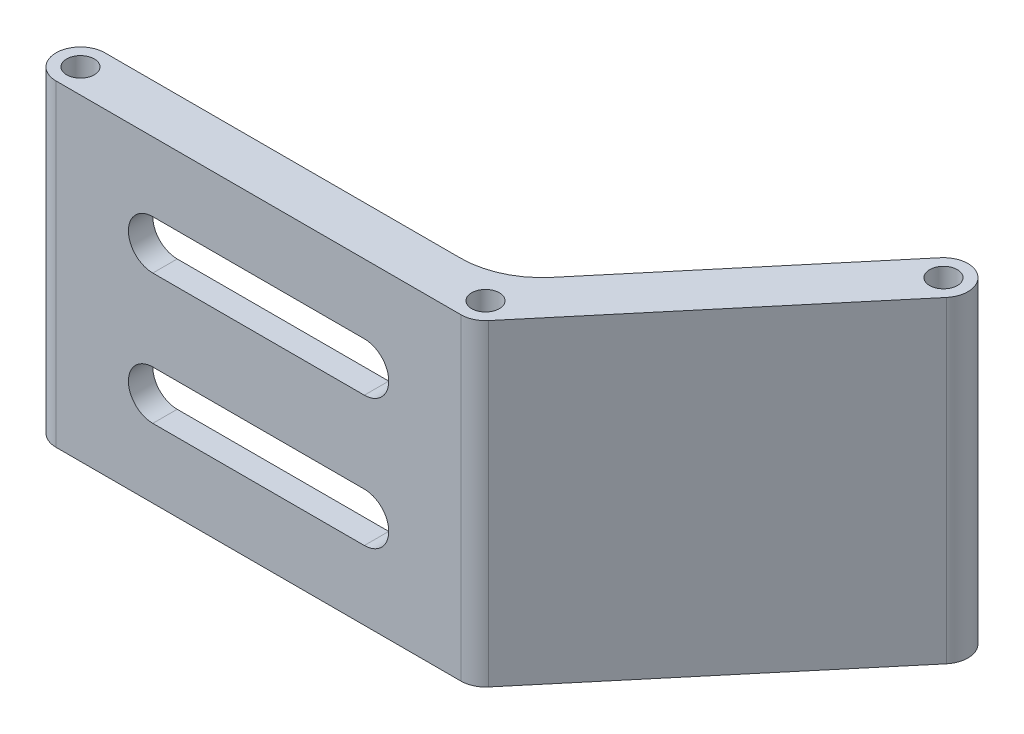
ISO-10303-21;
HEADER;
FILE_DESCRIPTION(('STEP AP214'),'2;1');
FILE_NAME('part.step','',(''),(''),'','','');
FILE_SCHEMA(('AUTOMOTIVE_DESIGN { 1 0 10303 214 1 1 1 1 }'));
ENDSEC;
DATA;
#1=APPLICATION_CONTEXT('core data for automotive mechanical design processes');
#2=APPLICATION_PROTOCOL_DEFINITION('international standard','automotive_design',2000,#1);
#3=PRODUCT_CONTEXT('',#1,'mechanical');
#4=PRODUCT('Part','Part','',(#3));
#5=PRODUCT_RELATED_PRODUCT_CATEGORY('part','',(#4));
#6=PRODUCT_DEFINITION_FORMATION('','',#4);
#7=PRODUCT_DEFINITION_CONTEXT('part definition',#1,'design');
#8=PRODUCT_DEFINITION('design','',#6,#7);
#9=PRODUCT_DEFINITION_SHAPE('','',#8);
#10=(LENGTH_UNIT() NAMED_UNIT(*) SI_UNIT(.MILLI.,.METRE.));
#11=(NAMED_UNIT(*) PLANE_ANGLE_UNIT() SI_UNIT($,.RADIAN.));
#12=(NAMED_UNIT(*) SI_UNIT($,.STERADIAN.) SOLID_ANGLE_UNIT());
#13=UNCERTAINTY_MEASURE_WITH_UNIT(LENGTH_MEASURE(1.E-05),#10,'distance_accuracy_value','');
#14=(GEOMETRIC_REPRESENTATION_CONTEXT(3) GLOBAL_UNCERTAINTY_ASSIGNED_CONTEXT((#13)) GLOBAL_UNIT_ASSIGNED_CONTEXT((#10,
#11,#12)) REPRESENTATION_CONTEXT('',''));
#15=CARTESIAN_POINT('',(0.,0.,0.));
#16=DIRECTION('',(0.,0.,1.));
#17=DIRECTION('',(1.,0.,0.));
#18=AXIS2_PLACEMENT_3D('',#15,#16,#17);
#19=CARTESIAN_POINT('',(61.1988808877318,39.,-30.620225145052));
#20=DIRECTION('',(-0.642787609686542,0.,0.766044443118975));
#21=DIRECTION('',(0.766044443118976,0.,0.642787609686542));
#22=AXIS2_PLACEMENT_3D('',#19,#20,#21);
#23=PLANE('',#22);
#24=DIRECTION('',(-0.766044443118975,0.,-0.642787609686542));
#25=VECTOR('',#24,1.);
#26=CARTESIAN_POINT('',(61.1988808877318,0.,-30.620225145052));
#27=LINE('',#26,#25);
#28=CARTESIAN_POINT('',(63.4970142170887,0.,-28.6918623159923));
#29=VERTEX_POINT('',#28);
#30=CARTESIAN_POINT('',(63.4969810572547,0.,-28.6918901403968));
#31=VERTEX_POINT('',#30);
#32=EDGE_CURVE('E448',#29,#31,#27,.T.);
#33=ORIENTED_EDGE('',*,*,#32,.T.);
#34=DIRECTION('',(0.,1.,0.));
#35=VECTOR('',#34,1.);
#36=CARTESIAN_POINT('',(63.4969810572547,36.,-28.6918901403968));
#37=LINE('',#36,#35);
#38=CARTESIAN_POINT('',(63.4969810572547,39.,-28.6918901403968));
#39=VERTEX_POINT('',#38);
#40=EDGE_CURVE('E518',#31,#39,#37,.T.);
#41=ORIENTED_EDGE('',*,*,#40,.T.);
#42=DIRECTION('',(-0.766044443118975,0.,-0.642787609686542));
#43=VECTOR('',#42,1.);
#44=CARTESIAN_POINT('',(61.1988808877318,39.,-30.620225145052));
#45=LINE('',#44,#43);
#46=CARTESIAN_POINT('',(63.4970142170887,39.,-28.6918623159923));
#47=VERTEX_POINT('',#46);
#48=EDGE_CURVE('E457',#47,#39,#45,.T.);
#49=ORIENTED_EDGE('',*,*,#48,.F.);
#50=DIRECTION('',(0.,-1.,0.));
#51=VECTOR('',#50,1.);
#52=CARTESIAN_POINT('',(63.4970142170887,39.,-28.6918623159923));
#53=LINE('',#52,#51);
#54=EDGE_CURVE('E461',#47,#29,#53,.T.);
#55=ORIENTED_EDGE('',*,*,#54,.T.);
#56=EDGE_LOOP('',(#33,#41,#49,#55));
#57=FACE_BOUND('',#56,.T.);
#58=ADVANCED_FACE('F39',(#57),#23,.F.);
#59=CARTESIAN_POINT('',(37.4338240910131,39.,-2.29813332935694));
#60=DIRECTION('',(0.766044443118979,0.,0.642787609686538));
#61=DIRECTION('',(0.642787609686538,0.,-0.766044443118979));
#62=AXIS2_PLACEMENT_3D('',#59,#60,#61);
#63=PLANE('',#62);
#64=DIRECTION('',(0.,-1.,0.));
#65=VECTOR('',#64,1.);
#66=CARTESIAN_POINT('',(59.2601589891967,39.,-28.3097463574317));
#67=LINE('',#66,#65);
#68=CARTESIAN_POINT('',(59.2601589891967,5.,-28.3097463574317));
#69=VERTEX_POINT('',#68);
#70=CARTESIAN_POINT('',(59.2601589891967,36.,-28.3097463574317));
#71=VERTEX_POINT('',#70);
#72=EDGE_CURVE('E232',#69,#71,#67,.F.);
#73=ORIENTED_EDGE('',*,*,#72,.F.);
#74=DIRECTION('',(-0.642787609686538,0.,0.766044443118979));
#75=VECTOR('',#74,1.);
#76=CARTESIAN_POINT('',(37.4338240910131,5.,-2.29813332935694));
#77=LINE('',#76,#75);
#78=CARTESIAN_POINT('',(40.8448561593638,5.,-6.3632430512679));
#79=VERTEX_POINT('',#78);
#80=EDGE_CURVE('E227',#69,#79,#77,.T.);
#81=ORIENTED_EDGE('',*,*,#80,.T.);
#82=DIRECTION('',(0.,1.,0.));
#83=VECTOR('',#82,1.);
#84=CARTESIAN_POINT('',(40.8448561593638,39.,-6.3632430512679));
#85=LINE('',#84,#83);
#86=CARTESIAN_POINT('',(40.8448561593638,36.,-6.3632430512679));
#87=VERTEX_POINT('',#86);
#88=EDGE_CURVE('E498',#79,#87,#85,.T.);
#89=ORIENTED_EDGE('',*,*,#88,.T.);
#90=DIRECTION('',(-0.642787609686538,0.,0.766044443118979));
#91=VECTOR('',#90,1.);
#92=CARTESIAN_POINT('',(37.4338240910131,36.,-2.29813332935694));
#93=LINE('',#92,#91);
#94=EDGE_CURVE('E279',#71,#87,#93,.T.);
#95=ORIENTED_EDGE('',*,*,#94,.F.);
#96=EDGE_LOOP('',(#73,#81,#89,#95));
#97=FACE_BOUND('',#96,.T.);
#98=ADVANCED_FACE('F607',(#97),#63,.F.);
#99=CARTESIAN_POINT('',(-14.2777011975798,5.,0.));
#100=DIRECTION('',(0.,1.,0.));
#101=DIRECTION('',(0.,0.,1.));
#102=AXIS2_PLACEMENT_3D('',#99,#100,#101);
#103=PLANE('',#102);
#104=ORIENTED_EDGE('',*,*,#80,.F.);
#105=CARTESIAN_POINT('',(61.1885218182563,5.,-30.6078796867887));
#106=DIRECTION('',(0.,1.,0.));
#107=DIRECTION('',(0.,0.,1.));
#108=AXIS2_PLACEMENT_3D('',#105,#106,#107);
#109=CIRCLE('',#108,3.00000000000005);
#110=CARTESIAN_POINT('',(58.8903884888994,5.,-32.5362425158483));
#111=VERTEX_POINT('',#110);
#112=EDGE_CURVE('E221',#69,#111,#109,.F.);
#113=ORIENTED_EDGE('',*,*,#112,.T.);
#114=DIRECTION('',(-0.642787609686538,0.,0.766044443118979));
#115=VECTOR('',#114,1.);
#116=CARTESIAN_POINT('',(33.2073279325966,5.,-1.92836282905961));
#117=LINE('',#116,#115);
#118=CARTESIAN_POINT('',(37.1039061371283,5.,-6.57212390313462));
#119=VERTEX_POINT('',#118);
#120=EDGE_CURVE('E225',#111,#119,#117,.T.);
#121=ORIENTED_EDGE('',*,*,#120,.T.);
#122=CARTESIAN_POINT('',(29.4434617059385,5.,-13.));
#123=DIRECTION('',(0.,1.,0.));
#124=DIRECTION('',(0.,0.,1.));
#125=AXIS2_PLACEMENT_3D('',#122,#123,#124);
#126=CIRCLE('',#125,10.);
#127=CARTESIAN_POINT('',(29.4434617059385,5.,-3.));
#128=VERTEX_POINT('',#127);
#129=EDGE_CURVE('E48',#119,#128,#126,.F.);
#130=ORIENTED_EDGE('',*,*,#129,.T.);
#131=DIRECTION('',(-1.,0.,0.));
#132=VECTOR('',#131,1.);
#133=CARTESIAN_POINT('',(-14.2777011975798,5.,-3.));
#134=LINE('',#133,#132);
#135=CARTESIAN_POINT('',(-14.2777011975798,5.,-3.));
#136=VERTEX_POINT('',#135);
#137=EDGE_CURVE('E397',#128,#136,#134,.T.);
#138=ORIENTED_EDGE('',*,*,#137,.T.);
#139=CARTESIAN_POINT('',(-14.2777011975798,5.,0.));
#140=DIRECTION('',(0.,1.,0.));
#141=DIRECTION('',(0.,0.,1.));
#142=AXIS2_PLACEMENT_3D('',#139,#140,#141);
#143=CIRCLE('',#142,3.);
#144=CARTESIAN_POINT('',(-12.3607879984449,5.,-2.30769230769231));
#145=VERTEX_POINT('',#144);
#146=EDGE_CURVE('E406',#145,#136,#143,.T.);
#147=ORIENTED_EDGE('',*,*,#146,.F.);
#148=CARTESIAN_POINT('',(-5.97107733466174,5.,-10.));
#149=DIRECTION('',(0.,1.,0.));
#150=DIRECTION('',(0.,0.,1.));
#151=AXIS2_PLACEMENT_3D('',#148,#149,#150);
#152=CIRCLE('',#151,10.);
#153=CARTESIAN_POINT('',(-5.97107733466174,5.,0.));
#154=VERTEX_POINT('',#153);
#155=EDGE_CURVE('E431',#154,#145,#152,.F.);
#156=ORIENTED_EDGE('',*,*,#155,.F.);
#157=DIRECTION('',(-1.,0.,0.));
#158=VECTOR('',#157,1.);
#159=CARTESIAN_POINT('',(-11.2777011975798,5.,0.));
#160=LINE('',#159,#158);
#161=CARTESIAN_POINT('',(27.1988373990354,5.,0.));
#162=VERTEX_POINT('',#161);
#163=EDGE_CURVE('E410',#162,#154,#160,.T.);
#164=ORIENTED_EDGE('',*,*,#163,.F.);
#165=CARTESIAN_POINT('',(27.1988373990354,5.,-10.));
#166=DIRECTION('',(0.,1.,0.));
#167=DIRECTION('',(0.,0.,1.));
#168=AXIS2_PLACEMENT_3D('',#165,#166,#167);
#169=CIRCLE('',#168,10.);
#170=CARTESIAN_POINT('',(33.5885480628186,5.,-2.30769230769231));
#171=VERTEX_POINT('',#170);
#172=EDGE_CURVE('E414',#171,#162,#169,.F.);
#173=ORIENTED_EDGE('',*,*,#172,.F.);
#174=CARTESIAN_POINT('',(35.5054612619535,5.,0.));
#175=DIRECTION('',(0.,1.,0.));
#176=DIRECTION('',(0.,0.,1.));
#177=AXIS2_PLACEMENT_3D('',#174,#175,#176);
#178=CIRCLE('',#177,3.);
#179=CARTESIAN_POINT('',(34.9698344464659,5.,-2.9517967264923));
#180=VERTEX_POINT('',#179);
#181=EDGE_CURVE('E417',#180,#171,#178,.T.);
#182=ORIENTED_EDGE('',*,*,#181,.F.);
#183=CARTESIAN_POINT('',(33.184411728174,5.,-12.7911191481333));
#184=DIRECTION('',(0.,1.,0.));
#185=DIRECTION('',(0.,0.,1.));
#186=AXIS2_PLACEMENT_3D('',#183,#184,#185);
#187=CIRCLE('',#186,10.);
#188=EDGE_CURVE('E421',#79,#180,#187,.F.);
#189=ORIENTED_EDGE('',*,*,#188,.F.);
#190=EDGE_LOOP('',(#104,#113,#121,#130,#138,#147,#156,#164,#173,#182,#189));
#191=FACE_BOUND('',#190,.T.);
#192=ADVANCED_FACE('F223',(#191),#103,.T.);
#193=CARTESIAN_POINT('',(-14.2777011975798,36.,0.));
#194=DIRECTION('',(0.,1.,0.));
#195=DIRECTION('',(0.,0.,1.));
#196=AXIS2_PLACEMENT_3D('',#193,#194,#195);
#197=PLANE('',#196);
#198=CARTESIAN_POINT('',(61.1885218182563,36.,-30.6078796867887));
#199=DIRECTION('',(0.,1.,0.));
#200=DIRECTION('',(0.,0.,1.));
#201=AXIS2_PLACEMENT_3D('',#198,#199,#200);
#202=CIRCLE('',#201,3.00000000000005);
#203=CARTESIAN_POINT('',(58.8903884888994,36.,-32.5362425158483));
#204=VERTEX_POINT('',#203);
#205=EDGE_CURVE('E582',#71,#204,#202,.F.);
#206=ORIENTED_EDGE('',*,*,#205,.F.);
#207=ORIENTED_EDGE('',*,*,#94,.T.);
#208=CARTESIAN_POINT('',(33.184411728174,36.,-12.7911191481333));
#209=DIRECTION('',(0.,1.,0.));
#210=DIRECTION('',(0.,0.,1.));
#211=AXIS2_PLACEMENT_3D('',#208,#209,#210);
#212=CIRCLE('',#211,10.);
#213=CARTESIAN_POINT('',(34.9698344464659,36.,-2.9517967264923));
#214=VERTEX_POINT('',#213);
#215=EDGE_CURVE('E393',#87,#214,#212,.F.);
#216=ORIENTED_EDGE('',*,*,#215,.T.);
#217=CARTESIAN_POINT('',(35.5054612619535,36.,0.));
#218=DIRECTION('',(0.,1.,0.));
#219=DIRECTION('',(0.,0.,1.));
#220=AXIS2_PLACEMENT_3D('',#217,#218,#219);
#221=CIRCLE('',#220,3.);
#222=CARTESIAN_POINT('',(33.5885480628186,36.,-2.30769230769231));
#223=VERTEX_POINT('',#222);
#224=EDGE_CURVE('E390',#214,#223,#221,.T.);
#225=ORIENTED_EDGE('',*,*,#224,.T.);
#226=CARTESIAN_POINT('',(27.1988373990354,36.,-10.));
#227=DIRECTION('',(0.,1.,0.));
#228=DIRECTION('',(0.,0.,1.));
#229=AXIS2_PLACEMENT_3D('',#226,#227,#228);
#230=CIRCLE('',#229,10.);
#231=CARTESIAN_POINT('',(27.1988373990354,36.,0.));
#232=VERTEX_POINT('',#231);
#233=EDGE_CURVE('E387',#223,#232,#230,.F.);
#234=ORIENTED_EDGE('',*,*,#233,.T.);
#235=DIRECTION('',(-1.,0.,0.));
#236=VECTOR('',#235,1.);
#237=CARTESIAN_POINT('',(-11.2777011975798,36.,0.));
#238=LINE('',#237,#236);
#239=CARTESIAN_POINT('',(-5.97107733466174,36.,0.));
#240=VERTEX_POINT('',#239);
#241=EDGE_CURVE('E384',#232,#240,#238,.T.);
#242=ORIENTED_EDGE('',*,*,#241,.T.);
#243=CARTESIAN_POINT('',(-5.97107733466174,36.,-10.));
#244=DIRECTION('',(0.,1.,0.));
#245=DIRECTION('',(0.,0.,1.));
#246=AXIS2_PLACEMENT_3D('',#243,#244,#245);
#247=CIRCLE('',#246,10.);
#248=CARTESIAN_POINT('',(-12.3607879984449,36.,-2.30769230769231));
#249=VERTEX_POINT('',#248);
#250=EDGE_CURVE('E430',#240,#249,#247,.F.);
#251=ORIENTED_EDGE('',*,*,#250,.T.);
#252=CARTESIAN_POINT('',(-14.2777011975798,36.,0.));
#253=DIRECTION('',(0.,1.,0.));
#254=DIRECTION('',(0.,0.,1.));
#255=AXIS2_PLACEMENT_3D('',#252,#253,#254);
#256=CIRCLE('',#255,3.);
#257=CARTESIAN_POINT('',(-14.2777011975798,36.,-3.));
#258=VERTEX_POINT('',#257);
#259=EDGE_CURVE('E380',#249,#258,#256,.T.);
#260=ORIENTED_EDGE('',*,*,#259,.T.);
#261=DIRECTION('',(-1.,0.,0.));
#262=VECTOR('',#261,1.);
#263=CARTESIAN_POINT('',(-14.2777011975798,36.,-3.));
#264=LINE('',#263,#262);
#265=CARTESIAN_POINT('',(29.4434617059385,36.,-3.));
#266=VERTEX_POINT('',#265);
#267=EDGE_CURVE('E371',#266,#258,#264,.T.);
#268=ORIENTED_EDGE('',*,*,#267,.F.);
#269=CARTESIAN_POINT('',(29.4434617059385,36.,-13.));
#270=DIRECTION('',(0.,1.,0.));
#271=DIRECTION('',(0.,0.,1.));
#272=AXIS2_PLACEMENT_3D('',#269,#270,#271);
#273=CIRCLE('',#272,10.);
#274=CARTESIAN_POINT('',(37.1039061371283,36.,-6.57212390313462));
#275=VERTEX_POINT('',#274);
#276=EDGE_CURVE('E535',#266,#275,#273,.T.);
#277=ORIENTED_EDGE('',*,*,#276,.T.);
#278=DIRECTION('',(-0.642787609686538,0.,0.766044443118979));
#279=VECTOR('',#278,1.);
#280=CARTESIAN_POINT('',(33.2073279325966,36.,-1.92836282905961));
#281=LINE('',#280,#279);
#282=EDGE_CURVE('E265',#204,#275,#281,.T.);
#283=ORIENTED_EDGE('',*,*,#282,.F.);
#284=EDGE_LOOP('',(#206,#207,#216,#225,#234,#242,#251,#260,#268,#277,#283));
#285=FACE_BOUND('',#284,.T.);
#286=ADVANCED_FACE('F543',(#285),#197,.F.);
#287=CARTESIAN_POINT('',(-14.2777011975798,5.,-3.));
#288=DIRECTION('',(0.,0.,1.));
#289=DIRECTION('',(1.,0.,0.));
#290=AXIS2_PLACEMENT_3D('',#287,#288,#289);
#291=PLANE('',#290);
#292=ORIENTED_EDGE('',*,*,#137,.F.);
#293=DIRECTION('',(0.,1.,0.));
#294=VECTOR('',#293,1.);
#295=CARTESIAN_POINT('',(29.4434617059385,0.,-3.));
#296=LINE('',#295,#294);
#297=CARTESIAN_POINT('',(29.4434617059385,0.,-3.));
#298=VERTEX_POINT('',#297);
#299=EDGE_CURVE('E61',#128,#298,#296,.F.);
#300=ORIENTED_EDGE('',*,*,#299,.T.);
#301=DIRECTION('',(-1.,0.,0.));
#302=VECTOR('',#301,1.);
#303=CARTESIAN_POINT('',(-14.2777011975798,0.,-3.));
#304=LINE('',#303,#302);
#305=CARTESIAN_POINT('',(-14.2777011975798,0.,-3.));
#306=VERTEX_POINT('',#305);
#307=EDGE_CURVE('E396',#298,#306,#304,.T.);
#308=ORIENTED_EDGE('',*,*,#307,.T.);
#309=DIRECTION('',(0.,-1.,0.));
#310=VECTOR('',#309,1.);
#311=CARTESIAN_POINT('',(-14.2777011975798,5.,-3.));
#312=LINE('',#311,#310);
#313=EDGE_CURVE('E400',#136,#306,#312,.T.);
#314=ORIENTED_EDGE('',*,*,#313,.F.);
#315=EDGE_LOOP('',(#292,#300,#308,#314));
#316=FACE_BOUND('',#315,.T.);
#317=ADVANCED_FACE('F638',(#316),#291,.F.);
#318=CARTESIAN_POINT('',(33.184411728174,39.,-12.7911191481333));
#319=DIRECTION('',(0.,-1.,0.));
#320=DIRECTION('',(0.,0.,-1.));
#321=AXIS2_PLACEMENT_3D('',#318,#319,#320);
#322=CYLINDRICAL_SURFACE('',#321,10.);
#323=ORIENTED_EDGE('',*,*,#88,.F.);
#324=ORIENTED_EDGE('',*,*,#188,.T.);
#325=DIRECTION('',(0.,-1.,0.));
#326=VECTOR('',#325,1.);
#327=CARTESIAN_POINT('',(34.9698344464659,39.,-2.9517967264923));
#328=LINE('',#327,#326);
#329=EDGE_CURVE('E495',#214,#180,#328,.T.);
#330=ORIENTED_EDGE('',*,*,#329,.F.);
#331=ORIENTED_EDGE('',*,*,#215,.F.);
#332=EDGE_LOOP('',(#323,#324,#330,#331));
#333=FACE_BOUND('',#332,.T.);
#334=ADVANCED_FACE('F634',(#333),#322,.F.);
#335=CARTESIAN_POINT('',(35.5054612619535,39.,0.));
#336=DIRECTION('',(0.,-1.,0.));
#337=DIRECTION('',(0.,0.,-1.));
#338=AXIS2_PLACEMENT_3D('',#335,#336,#337);
#339=CYLINDRICAL_SURFACE('',#338,3.);
#340=ORIENTED_EDGE('',*,*,#224,.F.);
#341=ORIENTED_EDGE('',*,*,#329,.T.);
#342=ORIENTED_EDGE('',*,*,#181,.T.);
#343=DIRECTION('',(0.,-1.,0.));
#344=VECTOR('',#343,1.);
#345=CARTESIAN_POINT('',(33.5885480628186,39.,-2.30769230769231));
#346=LINE('',#345,#344);
#347=EDGE_CURVE('E491',#171,#223,#346,.F.);
#348=ORIENTED_EDGE('',*,*,#347,.T.);
#349=EDGE_LOOP('',(#340,#341,#342,#348));
#350=FACE_BOUND('',#349,.T.);
#351=ADVANCED_FACE('F630',(#350),#339,.T.);
#352=CARTESIAN_POINT('',(-11.2777011975798,39.,0.));
#353=DIRECTION('',(0.,0.,1.));
#354=DIRECTION('',(1.,0.,0.));
#355=AXIS2_PLACEMENT_3D('',#352,#353,#354);
#356=PLANE('',#355);
#357=DIRECTION('',(-1.,0.,0.));
#358=VECTOR('',#357,1.);
#359=CARTESIAN_POINT('',(-11.2777011975798,30.5,0.));
#360=LINE('',#359,#358);
#361=CARTESIAN_POINT('',(23.6138800321868,30.5,0.));
#362=VERTEX_POINT('',#361);
#363=CARTESIAN_POINT('',(-2.38611996781316,30.5,0.));
#364=VERTEX_POINT('',#363);
#365=EDGE_CURVE('E362',#362,#364,#360,.T.);
#366=ORIENTED_EDGE('',*,*,#365,.T.);
#367=CARTESIAN_POINT('',(-2.38611996781316,27.5,0.));
#368=DIRECTION('',(0.,0.,1.));
#369=DIRECTION('',(1.,0.,0.));
#370=AXIS2_PLACEMENT_3D('',#367,#368,#369);
#371=CIRCLE('',#370,3.);
#372=CARTESIAN_POINT('',(-2.38611996781315,24.5,0.));
#373=VERTEX_POINT('',#372);
#374=EDGE_CURVE('E366',#364,#373,#371,.T.);
#375=ORIENTED_EDGE('',*,*,#374,.T.);
#376=DIRECTION('',(1.,0.,0.));
#377=VECTOR('',#376,1.);
#378=CARTESIAN_POINT('',(-11.2777011975798,24.5,0.));
#379=LINE('',#378,#377);
#380=CARTESIAN_POINT('',(23.6138800321868,24.5,0.));
#381=VERTEX_POINT('',#380);
#382=EDGE_CURVE('E354',#373,#381,#379,.T.);
#383=ORIENTED_EDGE('',*,*,#382,.T.);
#384=CARTESIAN_POINT('',(23.6138800321868,27.5,0.));
#385=DIRECTION('',(0.,0.,1.));
#386=DIRECTION('',(1.,0.,0.));
#387=AXIS2_PLACEMENT_3D('',#384,#385,#386);
#388=CIRCLE('',#387,3.);
#389=EDGE_CURVE('E358',#381,#362,#388,.T.);
#390=ORIENTED_EDGE('',*,*,#389,.T.);
#391=EDGE_LOOP('',(#366,#375,#383,#390));
#392=FACE_BOUND('',#391,.T.);
#393=DIRECTION('',(-1.,0.,0.));
#394=VECTOR('',#393,1.);
#395=CARTESIAN_POINT('',(-11.2777011975798,14.5,0.));
#396=LINE('',#395,#394);
#397=CARTESIAN_POINT('',(23.6138800321868,14.5,0.));
#398=VERTEX_POINT('',#397);
#399=CARTESIAN_POINT('',(-2.38611996781315,14.5,0.));
#400=VERTEX_POINT('',#399);
#401=EDGE_CURVE('E346',#398,#400,#396,.T.);
#402=ORIENTED_EDGE('',*,*,#401,.T.);
#403=CARTESIAN_POINT('',(-2.38611996781316,11.5,0.));
#404=DIRECTION('',(0.,0.,1.));
#405=DIRECTION('',(1.,0.,0.));
#406=AXIS2_PLACEMENT_3D('',#403,#404,#405);
#407=CIRCLE('',#406,3.);
#408=CARTESIAN_POINT('',(-2.38611996781315,8.5,0.));
#409=VERTEX_POINT('',#408);
#410=EDGE_CURVE('E350',#400,#409,#407,.T.);
#411=ORIENTED_EDGE('',*,*,#410,.T.);
#412=DIRECTION('',(1.,0.,0.));
#413=VECTOR('',#412,1.);
#414=CARTESIAN_POINT('',(-11.2777011975798,8.5,0.));
#415=LINE('',#414,#413);
#416=CARTESIAN_POINT('',(23.6138800321868,8.5,0.));
#417=VERTEX_POINT('',#416);
#418=EDGE_CURVE('E303',#409,#417,#415,.T.);
#419=ORIENTED_EDGE('',*,*,#418,.T.);
#420=CARTESIAN_POINT('',(23.6138800321868,11.5,0.));
#421=DIRECTION('',(0.,0.,1.));
#422=DIRECTION('',(1.,0.,0.));
#423=AXIS2_PLACEMENT_3D('',#420,#421,#422);
#424=CIRCLE('',#423,3.);
#425=EDGE_CURVE('E342',#417,#398,#424,.T.);
#426=ORIENTED_EDGE('',*,*,#425,.T.);
#427=EDGE_LOOP('',(#402,#411,#419,#426));
#428=FACE_BOUND('',#427,.T.);
#429=ORIENTED_EDGE('',*,*,#241,.F.);
#430=DIRECTION('',(0.,1.,0.));
#431=VECTOR('',#430,1.);
#432=CARTESIAN_POINT('',(27.1988373990354,0.,0.));
#433=LINE('',#432,#431);
#434=EDGE_CURVE('E506',#232,#162,#433,.F.);
#435=ORIENTED_EDGE('',*,*,#434,.T.);
#436=ORIENTED_EDGE('',*,*,#163,.T.);
#437=DIRECTION('',(0.,1.,0.));
#438=VECTOR('',#437,1.);
#439=CARTESIAN_POINT('',(-5.97107733466174,39.,0.));
#440=LINE('',#439,#438);
#441=EDGE_CURVE('E502',#154,#240,#440,.T.);
#442=ORIENTED_EDGE('',*,*,#441,.T.);
#443=EDGE_LOOP('',(#429,#435,#436,#442));
#444=FACE_BOUND('',#443,.T.);
#445=ADVANCED_FACE('F626',(#392,#428,#444),#356,.F.);
#446=CARTESIAN_POINT('',(27.1988373990354,39.,-10.));
#447=DIRECTION('',(0.,-1.,0.));
#448=DIRECTION('',(0.,0.,-1.));
#449=AXIS2_PLACEMENT_3D('',#446,#447,#448);
#450=CYLINDRICAL_SURFACE('',#449,10.);
#451=ORIENTED_EDGE('',*,*,#233,.F.);
#452=ORIENTED_EDGE('',*,*,#347,.F.);
#453=ORIENTED_EDGE('',*,*,#172,.T.);
#454=ORIENTED_EDGE('',*,*,#434,.F.);
#455=EDGE_LOOP('',(#451,#452,#453,#454));
#456=FACE_BOUND('',#455,.T.);
#457=ADVANCED_FACE('F629',(#456),#450,.F.);
#458=CARTESIAN_POINT('',(-5.97107733466174,39.,-10.));
#459=DIRECTION('',(0.,-1.,0.));
#460=DIRECTION('',(0.,0.,-1.));
#461=AXIS2_PLACEMENT_3D('',#458,#459,#460);
#462=CYLINDRICAL_SURFACE('',#461,10.);
#463=ORIENTED_EDGE('',*,*,#250,.F.);
#464=ORIENTED_EDGE('',*,*,#441,.F.);
#465=ORIENTED_EDGE('',*,*,#155,.T.);
#466=DIRECTION('',(0.,-1.,0.));
#467=VECTOR('',#466,1.);
#468=CARTESIAN_POINT('',(-12.3607879984449,39.,-2.30769230769231));
#469=LINE('',#468,#467);
#470=EDGE_CURVE('E510',#249,#145,#469,.T.);
#471=ORIENTED_EDGE('',*,*,#470,.F.);
#472=EDGE_LOOP('',(#463,#464,#465,#471));
#473=FACE_BOUND('',#472,.T.);
#474=ADVANCED_FACE('F642',(#473),#462,.F.);
#475=CARTESIAN_POINT('',(35.5054612619535,39.,0.));
#476=DIRECTION('',(0.,1.,0.));
#477=DIRECTION('',(0.,0.,1.));
#478=AXIS2_PLACEMENT_3D('',#475,#476,#477);
#479=PLANE('',#478);
#480=DIRECTION('',(0.642787609686538,0.,-0.766044443118979));
#481=VECTOR('',#480,1.);
#482=CARTESIAN_POINT('',(37.8035945913104,39.,1.92836282905961));
#483=LINE('',#482,#481);
#484=CARTESIAN_POINT('',(37.8035945913104,39.,1.92836282905961));
#485=VERTEX_POINT('',#484);
#486=EDGE_CURVE('E454',#485,#47,#483,.T.);
#487=ORIENTED_EDGE('',*,*,#486,.T.);
#488=ORIENTED_EDGE('',*,*,#48,.T.);
#489=CARTESIAN_POINT('',(61.1885218182563,39.,-30.6078796867887));
#490=DIRECTION('',(0.,1.,0.));
#491=DIRECTION('',(0.,0.,1.));
#492=AXIS2_PLACEMENT_3D('',#489,#490,#491);
#493=CIRCLE('',#492,3.);
#494=CARTESIAN_POINT('',(58.8903884888994,39.,-32.5362425158483));
#495=VERTEX_POINT('',#494);
#496=EDGE_CURVE('E264',#39,#495,#493,.T.);
#497=ORIENTED_EDGE('',*,*,#496,.T.);
#498=DIRECTION('',(-0.642787609686538,0.,0.766044443118979));
#499=VECTOR('',#498,1.);
#500=CARTESIAN_POINT('',(33.2073279325966,39.,-1.92836282905961));
#501=LINE('',#500,#499);
#502=CARTESIAN_POINT('',(37.1039061371283,39.,-6.57212390313462));
#503=VERTEX_POINT('',#502);
#504=EDGE_CURVE('E270',#495,#503,#501,.T.);
#505=ORIENTED_EDGE('',*,*,#504,.T.);
#506=CARTESIAN_POINT('',(29.4434617059385,39.,-13.));
#507=DIRECTION('',(0.,1.,0.));
#508=DIRECTION('',(0.,0.,1.));
#509=AXIS2_PLACEMENT_3D('',#506,#507,#508);
#510=CIRCLE('',#509,10.);
#511=CARTESIAN_POINT('',(29.4434617059385,39.,-3.));
#512=VERTEX_POINT('',#511);
#513=EDGE_CURVE('E532',#503,#512,#510,.F.);
#514=ORIENTED_EDGE('',*,*,#513,.T.);
#515=DIRECTION('',(-1.,0.,0.));
#516=VECTOR('',#515,1.);
#517=CARTESIAN_POINT('',(-14.2777011975798,39.,-3.));
#518=LINE('',#517,#516);
#519=CARTESIAN_POINT('',(-14.2777011975798,39.,-3.));
#520=VERTEX_POINT('',#519);
#521=EDGE_CURVE('E370',#512,#520,#518,.T.);
#522=ORIENTED_EDGE('',*,*,#521,.T.);
#523=CARTESIAN_POINT('',(-14.2777011975798,39.,0.));
#524=DIRECTION('',(0.,1.,0.));
#525=DIRECTION('',(0.,0.,1.));
#526=AXIS2_PLACEMENT_3D('',#523,#524,#525);
#527=CIRCLE('',#526,3.);
#528=CARTESIAN_POINT('',(-14.2777011975798,39.,3.));
#529=VERTEX_POINT('',#528);
#530=EDGE_CURVE('E444',#520,#529,#527,.T.);
#531=ORIENTED_EDGE('',*,*,#530,.T.);
#532=DIRECTION('',(1.,0.,0.));
#533=VECTOR('',#532,1.);
#534=CARTESIAN_POINT('',(-14.2777011975798,39.,3.));
#535=LINE('',#534,#533);
#536=CARTESIAN_POINT('',(35.5054612619535,39.,3.));
#537=VERTEX_POINT('',#536);
#538=EDGE_CURVE('E447',#529,#537,#535,.T.);
#539=ORIENTED_EDGE('',*,*,#538,.T.);
#540=CARTESIAN_POINT('',(35.5054612619535,39.,0.));
#541=DIRECTION('',(0.,1.,0.));
#542=DIRECTION('',(0.,0.,1.));
#543=AXIS2_PLACEMENT_3D('',#540,#541,#542);
#544=CIRCLE('',#543,3.);
#545=EDGE_CURVE('E451',#537,#485,#544,.T.);
#546=ORIENTED_EDGE('',*,*,#545,.T.);
#547=EDGE_LOOP('',(#487,#488,#497,#505,#514,#522,#531,#539,#546));
#548=FACE_BOUND('',#547,.T.);
#549=CARTESIAN_POINT('',(35.5054612619535,39.,0.));
#550=DIRECTION('',(0.,1.,0.));
#551=DIRECTION('',(0.,0.,1.));
#552=AXIS2_PLACEMENT_3D('',#549,#550,#551);
#553=CIRCLE('',#552,1.7);
#554=CARTESIAN_POINT('',(35.5054612619535,39.,1.7));
#555=VERTEX_POINT('',#554);
#556=EDGE_CURVE('E432',#555,#555,#553,.T.);
#557=ORIENTED_EDGE('',*,*,#556,.F.);
#558=EDGE_LOOP('',(#557));
#559=FACE_BOUND('',#558,.T.);
#560=CARTESIAN_POINT('',(-14.2777011975798,39.,0.));
#561=DIRECTION('',(0.,1.,0.));
#562=DIRECTION('',(0.,0.,1.));
#563=AXIS2_PLACEMENT_3D('',#560,#561,#562);
#564=CIRCLE('',#563,1.7);
#565=CARTESIAN_POINT('',(-14.2777011975798,39.,1.7));
#566=VERTEX_POINT('',#565);
#567=EDGE_CURVE('E436',#566,#566,#564,.T.);
#568=ORIENTED_EDGE('',*,*,#567,.F.);
#569=EDGE_LOOP('',(#568));
#570=FACE_BOUND('',#569,.T.);
#571=CARTESIAN_POINT('',(61.1885218182563,39.,-30.6078796867887));
#572=DIRECTION('',(0.,1.,0.));
#573=DIRECTION('',(0.,0.,1.));
#574=AXIS2_PLACEMENT_3D('',#571,#572,#573);
#575=CIRCLE('',#574,1.70000000000001);
#576=CARTESIAN_POINT('',(61.1885218182563,39.,-28.9078796867887));
#577=VERTEX_POINT('',#576);
#578=EDGE_CURVE('E260',#577,#577,#575,.T.);
#579=ORIENTED_EDGE('',*,*,#578,.F.);
#580=EDGE_LOOP('',(#579));
#581=FACE_BOUND('',#580,.T.);
#582=ADVANCED_FACE('F554',(#548,#559,#570,#581),#479,.T.);
#583=CARTESIAN_POINT('',(35.5054612619535,0.,0.));
#584=DIRECTION('',(0.,1.,0.));
#585=DIRECTION('',(0.,0.,1.));
#586=AXIS2_PLACEMENT_3D('',#583,#584,#585);
#587=PLANE('',#586);
#588=CARTESIAN_POINT('',(61.1885218182563,0.,-30.6078796867887));
#589=DIRECTION('',(0.,1.,0.));
#590=DIRECTION('',(0.,0.,1.));
#591=AXIS2_PLACEMENT_3D('',#588,#589,#590);
#592=CIRCLE('',#591,1.70000000000001);
#593=CARTESIAN_POINT('',(61.1885218182563,0.,-28.9078796867887));
#594=VERTEX_POINT('',#593);
#595=EDGE_CURVE('E231',#594,#594,#592,.T.);
#596=ORIENTED_EDGE('',*,*,#595,.T.);
#597=EDGE_LOOP('',(#596));
#598=FACE_BOUND('',#597,.T.);
#599=DIRECTION('',(-0.642787609686538,0.,0.766044443118979));
#600=VECTOR('',#599,1.);
#601=CARTESIAN_POINT('',(33.2073279325966,0.,-1.92836282905961));
#602=LINE('',#601,#600);
#603=CARTESIAN_POINT('',(58.8903884888994,0.,-32.5362425158483));
#604=VERTEX_POINT('',#603);
#605=CARTESIAN_POINT('',(37.1039061371283,0.,-6.57212390313462));
#606=VERTEX_POINT('',#605);
#607=EDGE_CURVE('E249',#604,#606,#602,.T.);
#608=ORIENTED_EDGE('',*,*,#607,.F.);
#609=CARTESIAN_POINT('',(61.1885218182563,0.,-30.6078796867887));
#610=DIRECTION('',(0.,1.,0.));
#611=DIRECTION('',(0.,0.,1.));
#612=AXIS2_PLACEMENT_3D('',#609,#610,#611);
#613=CIRCLE('',#612,3.);
#614=EDGE_CURVE('E238',#31,#604,#613,.T.);
#615=ORIENTED_EDGE('',*,*,#614,.F.);
#616=ORIENTED_EDGE('',*,*,#32,.F.);
#617=DIRECTION('',(0.642787609686538,0.,-0.766044443118979));
#618=VECTOR('',#617,1.);
#619=CARTESIAN_POINT('',(37.8035945913104,0.,1.92836282905961));
#620=LINE('',#619,#618);
#621=CARTESIAN_POINT('',(37.8035945913104,0.,1.92836282905961));
#622=VERTEX_POINT('',#621);
#623=EDGE_CURVE('E473',#622,#29,#620,.T.);
#624=ORIENTED_EDGE('',*,*,#623,.F.);
#625=CARTESIAN_POINT('',(35.5054612619535,0.,0.));
#626=DIRECTION('',(0.,1.,0.));
#627=DIRECTION('',(0.,0.,1.));
#628=AXIS2_PLACEMENT_3D('',#625,#626,#627);
#629=CIRCLE('',#628,3.);
#630=CARTESIAN_POINT('',(35.5054612619535,0.,3.));
#631=VERTEX_POINT('',#630);
#632=EDGE_CURVE('E469',#631,#622,#629,.T.);
#633=ORIENTED_EDGE('',*,*,#632,.F.);
#634=DIRECTION('',(1.,0.,0.));
#635=VECTOR('',#634,1.);
#636=CARTESIAN_POINT('',(-14.2777011975798,0.,3.));
#637=LINE('',#636,#635);
#638=CARTESIAN_POINT('',(-14.2777011975798,0.,3.));
#639=VERTEX_POINT('',#638);
#640=EDGE_CURVE('E465',#639,#631,#637,.T.);
#641=ORIENTED_EDGE('',*,*,#640,.F.);
#642=CARTESIAN_POINT('',(-14.2777011975798,0.,0.));
#643=DIRECTION('',(0.,1.,0.));
#644=DIRECTION('',(0.,0.,1.));
#645=AXIS2_PLACEMENT_3D('',#642,#643,#644);
#646=CIRCLE('',#645,3.);
#647=EDGE_CURVE('E443',#306,#639,#646,.T.);
#648=ORIENTED_EDGE('',*,*,#647,.F.);
#649=ORIENTED_EDGE('',*,*,#307,.F.);
#650=CARTESIAN_POINT('',(29.4434617059385,0.,-13.));
#651=DIRECTION('',(0.,1.,0.));
#652=DIRECTION('',(0.,0.,1.));
#653=AXIS2_PLACEMENT_3D('',#650,#651,#652);
#654=CIRCLE('',#653,10.);
#655=EDGE_CURVE('E11',#298,#606,#654,.T.);
#656=ORIENTED_EDGE('',*,*,#655,.T.);
#657=EDGE_LOOP('',(#608,#615,#616,#624,#633,#641,#648,#649,#656));
#658=FACE_BOUND('',#657,.T.);
#659=CARTESIAN_POINT('',(35.5054612619535,0.,0.));
#660=DIRECTION('',(0.,1.,0.));
#661=DIRECTION('',(0.,0.,1.));
#662=AXIS2_PLACEMENT_3D('',#659,#660,#661);
#663=CIRCLE('',#662,1.7);
#664=CARTESIAN_POINT('',(35.5054612619535,0.,1.7));
#665=VERTEX_POINT('',#664);
#666=EDGE_CURVE('E425',#665,#665,#663,.T.);
#667=ORIENTED_EDGE('',*,*,#666,.T.);
#668=EDGE_LOOP('',(#667));
#669=FACE_BOUND('',#668,.T.);
#670=ADVANCED_FACE('F591',(#598,#658,#669),#587,.F.);
#671=CARTESIAN_POINT('',(-14.2777011975798,39.,0.));
#672=DIRECTION('',(0.,-1.,0.));
#673=DIRECTION('',(0.,0.,-1.));
#674=AXIS2_PLACEMENT_3D('',#671,#672,#673);
#675=CYLINDRICAL_SURFACE('',#674,3.);
#676=ORIENTED_EDGE('',*,*,#530,.F.);
#677=DIRECTION('',(0.,1.,0.));
#678=VECTOR('',#677,1.);
#679=CARTESIAN_POINT('',(-14.2777011975798,36.,-3.));
#680=LINE('',#679,#678);
#681=EDGE_CURVE('E374',#258,#520,#680,.T.);
#682=ORIENTED_EDGE('',*,*,#681,.F.);
#683=ORIENTED_EDGE('',*,*,#259,.F.);
#684=ORIENTED_EDGE('',*,*,#470,.T.);
#685=ORIENTED_EDGE('',*,*,#146,.T.);
#686=ORIENTED_EDGE('',*,*,#313,.T.);
#687=ORIENTED_EDGE('',*,*,#647,.T.);
#688=DIRECTION('',(0.,-1.,0.));
#689=VECTOR('',#688,1.);
#690=CARTESIAN_POINT('',(-14.2777011975798,39.,3.));
#691=LINE('',#690,#689);
#692=EDGE_CURVE('E488',#529,#639,#691,.T.);
#693=ORIENTED_EDGE('',*,*,#692,.F.);
#694=EDGE_LOOP('',(#676,#682,#683,#684,#685,#686,#687,#693));
#695=FACE_BOUND('',#694,.T.);
#696=ADVANCED_FACE('F563',(#695),#675,.T.);
#697=CARTESIAN_POINT('',(-14.2777011975798,39.,3.));
#698=DIRECTION('',(0.,0.,-1.));
#699=DIRECTION('',(-1.,0.,0.));
#700=AXIS2_PLACEMENT_3D('',#697,#698,#699);
#701=PLANE('',#700);
#702=DIRECTION('',(1.,0.,0.));
#703=VECTOR('',#702,1.);
#704=CARTESIAN_POINT('',(-2.38611996781315,24.5,3.));
#705=LINE('',#704,#703);
#706=CARTESIAN_POINT('',(-2.38611996781315,24.5,3.));
#707=VERTEX_POINT('',#706);
#708=CARTESIAN_POINT('',(23.6138800321868,24.5,3.));
#709=VERTEX_POINT('',#708);
#710=EDGE_CURVE('E286',#707,#709,#705,.T.);
#711=ORIENTED_EDGE('',*,*,#710,.F.);
#712=CARTESIAN_POINT('',(-2.38611996781316,27.5,3.));
#713=DIRECTION('',(0.,0.,1.));
#714=DIRECTION('',(1.,0.,0.));
#715=AXIS2_PLACEMENT_3D('',#712,#713,#714);
#716=CIRCLE('',#715,3.);
#717=CARTESIAN_POINT('',(-2.38611996781316,30.5,3.));
#718=VERTEX_POINT('',#717);
#719=EDGE_CURVE('E283',#718,#707,#716,.T.);
#720=ORIENTED_EDGE('',*,*,#719,.F.);
#721=DIRECTION('',(-1.,0.,0.));
#722=VECTOR('',#721,1.);
#723=CARTESIAN_POINT('',(-2.38611996781316,30.5,3.));
#724=LINE('',#723,#722);
#725=CARTESIAN_POINT('',(23.6138800321868,30.5,3.));
#726=VERTEX_POINT('',#725);
#727=EDGE_CURVE('E295',#726,#718,#724,.T.);
#728=ORIENTED_EDGE('',*,*,#727,.F.);
#729=CARTESIAN_POINT('',(23.6138800321868,27.5,3.));
#730=DIRECTION('',(0.,0.,1.));
#731=DIRECTION('',(1.,0.,0.));
#732=AXIS2_PLACEMENT_3D('',#729,#730,#731);
#733=CIRCLE('',#732,3.);
#734=EDGE_CURVE('E291',#709,#726,#733,.T.);
#735=ORIENTED_EDGE('',*,*,#734,.F.);
#736=EDGE_LOOP('',(#711,#720,#728,#735));
#737=FACE_BOUND('',#736,.T.);
#738=DIRECTION('',(1.,0.,0.));
#739=VECTOR('',#738,1.);
#740=CARTESIAN_POINT('',(-2.38611996781315,8.5,3.));
#741=LINE('',#740,#739);
#742=CARTESIAN_POINT('',(-2.38611996781315,8.5,3.));
#743=VERTEX_POINT('',#742);
#744=CARTESIAN_POINT('',(23.6138800321868,8.5,3.));
#745=VERTEX_POINT('',#744);
#746=EDGE_CURVE('E315',#743,#745,#741,.T.);
#747=ORIENTED_EDGE('',*,*,#746,.F.);
#748=CARTESIAN_POINT('',(-2.38611996781316,11.5,3.));
#749=DIRECTION('',(0.,0.,1.));
#750=DIRECTION('',(-1.,0.,0.));
#751=AXIS2_PLACEMENT_3D('',#748,#749,#750);
#752=CIRCLE('',#751,3.);
#753=CARTESIAN_POINT('',(-2.38611996781315,14.5,3.));
#754=VERTEX_POINT('',#753);
#755=EDGE_CURVE('E282',#754,#743,#752,.T.);
#756=ORIENTED_EDGE('',*,*,#755,.F.);
#757=DIRECTION('',(-1.,0.,0.));
#758=VECTOR('',#757,1.);
#759=CARTESIAN_POINT('',(-2.38611996781315,14.5,3.));
#760=LINE('',#759,#758);
#761=CARTESIAN_POINT('',(23.6138800321868,14.5,3.));
#762=VERTEX_POINT('',#761);
#763=EDGE_CURVE('E323',#762,#754,#760,.T.);
#764=ORIENTED_EDGE('',*,*,#763,.F.);
#765=CARTESIAN_POINT('',(23.6138800321868,11.5,3.));
#766=DIRECTION('',(0.,0.,1.));
#767=DIRECTION('',(-1.,0.,0.));
#768=AXIS2_PLACEMENT_3D('',#765,#766,#767);
#769=CIRCLE('',#768,3.);
#770=EDGE_CURVE('E319',#745,#762,#769,.T.);
#771=ORIENTED_EDGE('',*,*,#770,.F.);
#772=EDGE_LOOP('',(#747,#756,#764,#771));
#773=FACE_BOUND('',#772,.T.);
#774=ORIENTED_EDGE('',*,*,#692,.T.);
#775=ORIENTED_EDGE('',*,*,#640,.T.);
#776=DIRECTION('',(0.,-1.,0.));
#777=VECTOR('',#776,1.);
#778=CARTESIAN_POINT('',(35.5054612619535,39.,3.));
#779=LINE('',#778,#777);
#780=EDGE_CURVE('E485',#537,#631,#779,.T.);
#781=ORIENTED_EDGE('',*,*,#780,.F.);
#782=ORIENTED_EDGE('',*,*,#538,.F.);
#783=EDGE_LOOP('',(#774,#775,#781,#782));
#784=FACE_BOUND('',#783,.T.);
#785=ADVANCED_FACE('F569',(#737,#773,#784),#701,.F.);
#786=CARTESIAN_POINT('',(35.5054612619535,39.,0.));
#787=DIRECTION('',(0.,-1.,0.));
#788=DIRECTION('',(0.,0.,-1.));
#789=AXIS2_PLACEMENT_3D('',#786,#787,#788);
#790=CYLINDRICAL_SURFACE('',#789,3.);
#791=ORIENTED_EDGE('',*,*,#780,.T.);
#792=ORIENTED_EDGE('',*,*,#632,.T.);
#793=DIRECTION('',(0.,-1.,0.));
#794=VECTOR('',#793,1.);
#795=CARTESIAN_POINT('',(37.8035945913104,39.,1.92836282905961));
#796=LINE('',#795,#794);
#797=EDGE_CURVE('E482',#485,#622,#796,.T.);
#798=ORIENTED_EDGE('',*,*,#797,.F.);
#799=ORIENTED_EDGE('',*,*,#545,.F.);
#800=EDGE_LOOP('',(#791,#792,#798,#799));
#801=FACE_BOUND('',#800,.T.);
#802=ADVANCED_FACE('F573',(#801),#790,.T.);
#803=CARTESIAN_POINT('',(37.8035945913104,39.,1.92836282905961));
#804=DIRECTION('',(-0.766044443118979,0.,-0.642787609686538));
#805=DIRECTION('',(-0.642787609686538,0.,0.766044443118979));
#806=AXIS2_PLACEMENT_3D('',#803,#804,#805);
#807=PLANE('',#806);
#808=ORIENTED_EDGE('',*,*,#623,.T.);
#809=ORIENTED_EDGE('',*,*,#54,.F.);
#810=ORIENTED_EDGE('',*,*,#486,.F.);
#811=ORIENTED_EDGE('',*,*,#797,.T.);
#812=EDGE_LOOP('',(#808,#809,#810,#811));
#813=FACE_BOUND('',#812,.T.);
#814=ADVANCED_FACE('F578',(#813),#807,.F.);
#815=CARTESIAN_POINT('',(-14.2777011975798,39.,0.));
#816=DIRECTION('',(0.,-1.,0.));
#817=DIRECTION('',(0.,0.,-1.));
#818=AXIS2_PLACEMENT_3D('',#815,#816,#817);
#819=CYLINDRICAL_SURFACE('',#818,1.7);
#820=ORIENTED_EDGE('',*,*,#567,.T.);
#821=EDGE_LOOP('',(#820));
#822=FACE_BOUND('',#821,.T.);
#823=CARTESIAN_POINT('',(-14.2777011975798,5.,0.));
#824=DIRECTION('',(0.,1.,0.));
#825=DIRECTION('',(0.,0.,1.));
#826=AXIS2_PLACEMENT_3D('',#823,#824,#825);
#827=CIRCLE('',#826,1.7);
#828=CARTESIAN_POINT('',(-14.2777011975798,5.,1.7));
#829=VERTEX_POINT('',#828);
#830=EDGE_CURVE('E426',#829,#829,#827,.T.);
#831=ORIENTED_EDGE('',*,*,#830,.F.);
#832=EDGE_LOOP('',(#831));
#833=FACE_BOUND('',#832,.T.);
#834=ADVANCED_FACE('F618',(#822,#833),#819,.F.);
#835=CARTESIAN_POINT('',(35.5054612619535,39.,0.));
#836=DIRECTION('',(0.,-1.,0.));
#837=DIRECTION('',(0.,0.,-1.));
#838=AXIS2_PLACEMENT_3D('',#835,#836,#837);
#839=CYLINDRICAL_SURFACE('',#838,1.7);
#840=ORIENTED_EDGE('',*,*,#556,.T.);
#841=EDGE_LOOP('',(#840));
#842=FACE_BOUND('',#841,.T.);
#843=ORIENTED_EDGE('',*,*,#666,.F.);
#844=EDGE_LOOP('',(#843));
#845=FACE_BOUND('',#844,.T.);
#846=ADVANCED_FACE('F756',(#842,#845),#839,.F.);
#847=ORIENTED_EDGE('',*,*,#830,.T.);
#848=EDGE_LOOP('',(#847));
#849=FACE_BOUND('',#848,.T.);
#850=ADVANCED_FACE('F670',(#849),#103,.T.);
#851=CARTESIAN_POINT('',(-14.2777011975798,36.,-3.));
#852=DIRECTION('',(0.,0.,-1.));
#853=DIRECTION('',(-1.,0.,0.));
#854=AXIS2_PLACEMENT_3D('',#851,#852,#853);
#855=PLANE('',#854);
#856=ORIENTED_EDGE('',*,*,#521,.F.);
#857=DIRECTION('',(0.,1.,0.));
#858=VECTOR('',#857,1.);
#859=CARTESIAN_POINT('',(29.4434617059385,36.,-3.));
#860=LINE('',#859,#858);
#861=EDGE_CURVE('E525',#512,#266,#860,.F.);
#862=ORIENTED_EDGE('',*,*,#861,.T.);
#863=ORIENTED_EDGE('',*,*,#267,.T.);
#864=ORIENTED_EDGE('',*,*,#681,.T.);
#865=EDGE_LOOP('',(#856,#862,#863,#864));
#866=FACE_BOUND('',#865,.T.);
#867=ADVANCED_FACE('F557',(#866),#855,.T.);
#868=CARTESIAN_POINT('',(-2.38611996781316,11.5,-2.));
#869=DIRECTION('',(0.,0.,1.));
#870=DIRECTION('',(1.,0.,0.));
#871=AXIS2_PLACEMENT_3D('',#868,#869,#870);
#872=CYLINDRICAL_SURFACE('',#871,3.);
#873=DIRECTION('',(0.,0.,1.));
#874=VECTOR('',#873,1.);
#875=CARTESIAN_POINT('',(-2.38611996781315,14.5,-2.));
#876=LINE('',#875,#874);
#877=EDGE_CURVE('E287',#400,#754,#876,.T.);
#878=ORIENTED_EDGE('',*,*,#877,.T.);
#879=ORIENTED_EDGE('',*,*,#755,.T.);
#880=DIRECTION('',(0.,0.,1.));
#881=VECTOR('',#880,1.);
#882=CARTESIAN_POINT('',(-2.38611996781315,8.5,-2.));
#883=LINE('',#882,#881);
#884=EDGE_CURVE('E327',#409,#743,#883,.T.);
#885=ORIENTED_EDGE('',*,*,#884,.F.);
#886=ORIENTED_EDGE('',*,*,#410,.F.);
#887=EDGE_LOOP('',(#878,#879,#885,#886));
#888=FACE_BOUND('',#887,.T.);
#889=ADVANCED_FACE('F669',(#888),#872,.F.);
#890=CARTESIAN_POINT('',(-2.38611996781315,14.5,-2.));
#891=DIRECTION('',(0.,1.,0.));
#892=DIRECTION('',(0.,0.,1.));
#893=AXIS2_PLACEMENT_3D('',#890,#891,#892);
#894=PLANE('',#893);
#895=DIRECTION('',(0.,0.,1.));
#896=VECTOR('',#895,1.);
#897=CARTESIAN_POINT('',(23.6138800321868,14.5,-2.));
#898=LINE('',#897,#896);
#899=EDGE_CURVE('E330',#398,#762,#898,.T.);
#900=ORIENTED_EDGE('',*,*,#899,.T.);
#901=ORIENTED_EDGE('',*,*,#763,.T.);
#902=ORIENTED_EDGE('',*,*,#877,.F.);
#903=ORIENTED_EDGE('',*,*,#401,.F.);
#904=EDGE_LOOP('',(#900,#901,#902,#903));
#905=FACE_BOUND('',#904,.T.);
#906=ADVANCED_FACE('F844',(#905),#894,.F.);
#907=CARTESIAN_POINT('',(23.6138800321868,11.5,-2.));
#908=DIRECTION('',(0.,0.,1.));
#909=DIRECTION('',(1.,0.,0.));
#910=AXIS2_PLACEMENT_3D('',#907,#908,#909);
#911=CYLINDRICAL_SURFACE('',#910,3.);
#912=DIRECTION('',(0.,0.,1.));
#913=VECTOR('',#912,1.);
#914=CARTESIAN_POINT('',(23.6138800321868,8.5,-2.));
#915=LINE('',#914,#913);
#916=EDGE_CURVE('E333',#417,#745,#915,.T.);
#917=ORIENTED_EDGE('',*,*,#916,.T.);
#918=ORIENTED_EDGE('',*,*,#770,.T.);
#919=ORIENTED_EDGE('',*,*,#899,.F.);
#920=ORIENTED_EDGE('',*,*,#425,.F.);
#921=EDGE_LOOP('',(#917,#918,#919,#920));
#922=FACE_BOUND('',#921,.T.);
#923=ADVANCED_FACE('F834',(#922),#911,.F.);
#924=CARTESIAN_POINT('',(-2.38611996781315,8.5,-2.));
#925=DIRECTION('',(0.,-1.,0.));
#926=DIRECTION('',(0.,0.,-1.));
#927=AXIS2_PLACEMENT_3D('',#924,#925,#926);
#928=PLANE('',#927);
#929=ORIENTED_EDGE('',*,*,#884,.T.);
#930=ORIENTED_EDGE('',*,*,#746,.T.);
#931=ORIENTED_EDGE('',*,*,#916,.F.);
#932=ORIENTED_EDGE('',*,*,#418,.F.);
#933=EDGE_LOOP('',(#929,#930,#931,#932));
#934=FACE_BOUND('',#933,.T.);
#935=ADVANCED_FACE('F824',(#934),#928,.F.);
#936=CARTESIAN_POINT('',(-2.38611996781316,27.5,-2.));
#937=DIRECTION('',(0.,0.,1.));
#938=DIRECTION('',(1.,0.,0.));
#939=AXIS2_PLACEMENT_3D('',#936,#937,#938);
#940=CYLINDRICAL_SURFACE('',#939,3.);
#941=DIRECTION('',(0.,0.,1.));
#942=VECTOR('',#941,1.);
#943=CARTESIAN_POINT('',(-2.38611996781316,30.5,-2.));
#944=LINE('',#943,#942);
#945=EDGE_CURVE('E300',#364,#718,#944,.T.);
#946=ORIENTED_EDGE('',*,*,#945,.T.);
#947=ORIENTED_EDGE('',*,*,#719,.T.);
#948=DIRECTION('',(0.,0.,1.));
#949=VECTOR('',#948,1.);
#950=CARTESIAN_POINT('',(-2.38611996781315,24.5,-2.));
#951=LINE('',#950,#949);
#952=EDGE_CURVE('E299',#373,#707,#951,.T.);
#953=ORIENTED_EDGE('',*,*,#952,.F.);
#954=ORIENTED_EDGE('',*,*,#374,.F.);
#955=EDGE_LOOP('',(#946,#947,#953,#954));
#956=FACE_BOUND('',#955,.T.);
#957=ADVANCED_FACE('F814',(#956),#940,.F.);
#958=CARTESIAN_POINT('',(-2.38611996781316,30.5,-2.));
#959=DIRECTION('',(0.,1.,0.));
#960=DIRECTION('',(0.,0.,1.));
#961=AXIS2_PLACEMENT_3D('',#958,#959,#960);
#962=PLANE('',#961);
#963=DIRECTION('',(0.,0.,1.));
#964=VECTOR('',#963,1.);
#965=CARTESIAN_POINT('',(23.6138800321868,30.5,-2.));
#966=LINE('',#965,#964);
#967=EDGE_CURVE('E304',#362,#726,#966,.T.);
#968=ORIENTED_EDGE('',*,*,#967,.T.);
#969=ORIENTED_EDGE('',*,*,#727,.T.);
#970=ORIENTED_EDGE('',*,*,#945,.F.);
#971=ORIENTED_EDGE('',*,*,#365,.F.);
#972=EDGE_LOOP('',(#968,#969,#970,#971));
#973=FACE_BOUND('',#972,.T.);
#974=ADVANCED_FACE('F804',(#973),#962,.F.);
#975=CARTESIAN_POINT('',(23.6138800321868,27.5,-2.));
#976=DIRECTION('',(0.,0.,1.));
#977=DIRECTION('',(1.,0.,0.));
#978=AXIS2_PLACEMENT_3D('',#975,#976,#977);
#979=CYLINDRICAL_SURFACE('',#978,3.);
#980=DIRECTION('',(0.,0.,1.));
#981=VECTOR('',#980,1.);
#982=CARTESIAN_POINT('',(23.6138800321868,24.5,-2.));
#983=LINE('',#982,#981);
#984=EDGE_CURVE('E307',#381,#709,#983,.T.);
#985=ORIENTED_EDGE('',*,*,#984,.T.);
#986=ORIENTED_EDGE('',*,*,#734,.T.);
#987=ORIENTED_EDGE('',*,*,#967,.F.);
#988=ORIENTED_EDGE('',*,*,#389,.F.);
#989=EDGE_LOOP('',(#985,#986,#987,#988));
#990=FACE_BOUND('',#989,.T.);
#991=ADVANCED_FACE('F794',(#990),#979,.F.);
#992=CARTESIAN_POINT('',(-2.38611996781315,24.5,-2.));
#993=DIRECTION('',(0.,-1.,0.));
#994=DIRECTION('',(0.,0.,-1.));
#995=AXIS2_PLACEMENT_3D('',#992,#993,#994);
#996=PLANE('',#995);
#997=ORIENTED_EDGE('',*,*,#952,.T.);
#998=ORIENTED_EDGE('',*,*,#710,.T.);
#999=ORIENTED_EDGE('',*,*,#984,.F.);
#1000=ORIENTED_EDGE('',*,*,#382,.F.);
#1001=EDGE_LOOP('',(#997,#998,#999,#1000));
#1002=FACE_BOUND('',#1001,.T.);
#1003=ADVANCED_FACE('F603',(#1002),#996,.F.);
#1004=CARTESIAN_POINT('',(61.1885218182563,36.,-30.6078796867887));
#1005=DIRECTION('',(0.,1.,0.));
#1006=DIRECTION('',(0.,0.,1.));
#1007=AXIS2_PLACEMENT_3D('',#1004,#1005,#1006);
#1008=CYLINDRICAL_SURFACE('',#1007,3.);
#1009=ORIENTED_EDGE('',*,*,#40,.F.);
#1010=ORIENTED_EDGE('',*,*,#614,.T.);
#1011=DIRECTION('',(0.,-1.,0.));
#1012=VECTOR('',#1011,1.);
#1013=CARTESIAN_POINT('',(58.8903884888994,5.,-32.5362425158483));
#1014=LINE('',#1013,#1012);
#1015=EDGE_CURVE('E235',#111,#604,#1014,.T.);
#1016=ORIENTED_EDGE('',*,*,#1015,.F.);
#1017=ORIENTED_EDGE('',*,*,#112,.F.);
#1018=ORIENTED_EDGE('',*,*,#72,.T.);
#1019=ORIENTED_EDGE('',*,*,#205,.T.);
#1020=DIRECTION('',(0.,1.,0.));
#1021=VECTOR('',#1020,1.);
#1022=CARTESIAN_POINT('',(58.8903884888994,36.,-32.5362425158483));
#1023=LINE('',#1022,#1021);
#1024=EDGE_CURVE('E269',#204,#495,#1023,.T.);
#1025=ORIENTED_EDGE('',*,*,#1024,.T.);
#1026=ORIENTED_EDGE('',*,*,#496,.F.);
#1027=EDGE_LOOP('',(#1009,#1010,#1016,#1017,#1018,#1019,#1025,#1026));
#1028=FACE_BOUND('',#1027,.T.);
#1029=ADVANCED_FACE('F236',(#1028),#1008,.T.);
#1030=CARTESIAN_POINT('',(61.1885218182563,36.,-30.6078796867887));
#1031=DIRECTION('',(0.,1.,0.));
#1032=DIRECTION('',(0.,0.,1.));
#1033=AXIS2_PLACEMENT_3D('',#1030,#1031,#1032);
#1034=CYLINDRICAL_SURFACE('',#1033,1.70000000000001);
#1035=ORIENTED_EDGE('',*,*,#578,.T.);
#1036=EDGE_LOOP('',(#1035));
#1037=FACE_BOUND('',#1036,.T.);
#1038=ORIENTED_EDGE('',*,*,#595,.F.);
#1039=EDGE_LOOP('',(#1038));
#1040=FACE_BOUND('',#1039,.T.);
#1041=ADVANCED_FACE('F594',(#1037,#1040),#1034,.F.);
#1042=CARTESIAN_POINT('',(33.2073279325966,36.,-1.92836282905961));
#1043=DIRECTION('',(-0.766044443118979,0.,-0.642787609686538));
#1044=DIRECTION('',(-0.642787609686538,0.,0.766044443118979));
#1045=AXIS2_PLACEMENT_3D('',#1042,#1043,#1044);
#1046=PLANE('',#1045);
#1047=ORIENTED_EDGE('',*,*,#282,.T.);
#1048=DIRECTION('',(0.,1.,0.));
#1049=VECTOR('',#1048,1.);
#1050=CARTESIAN_POINT('',(37.1039061371283,39.,-6.57212390313462));
#1051=LINE('',#1050,#1049);
#1052=EDGE_CURVE('E521',#275,#503,#1051,.T.);
#1053=ORIENTED_EDGE('',*,*,#1052,.T.);
#1054=ORIENTED_EDGE('',*,*,#504,.F.);
#1055=ORIENTED_EDGE('',*,*,#1024,.F.);
#1056=EDGE_LOOP('',(#1047,#1053,#1054,#1055));
#1057=FACE_BOUND('',#1056,.T.);
#1058=ADVANCED_FACE('F549',(#1057),#1046,.T.);
#1059=CARTESIAN_POINT('',(33.2073279325966,5.,-1.92836282905961));
#1060=DIRECTION('',(0.766044443118979,0.,0.642787609686538));
#1061=DIRECTION('',(0.642787609686538,0.,-0.766044443118979));
#1062=AXIS2_PLACEMENT_3D('',#1059,#1060,#1061);
#1063=PLANE('',#1062);
#1064=ORIENTED_EDGE('',*,*,#607,.T.);
#1065=DIRECTION('',(0.,1.,0.));
#1066=VECTOR('',#1065,1.);
#1067=CARTESIAN_POINT('',(37.1039061371283,5.,-6.57212390313462));
#1068=LINE('',#1067,#1066);
#1069=EDGE_CURVE('E247',#606,#119,#1068,.T.);
#1070=ORIENTED_EDGE('',*,*,#1069,.T.);
#1071=ORIENTED_EDGE('',*,*,#120,.F.);
#1072=ORIENTED_EDGE('',*,*,#1015,.T.);
#1073=EDGE_LOOP('',(#1064,#1070,#1071,#1072));
#1074=FACE_BOUND('',#1073,.T.);
#1075=ADVANCED_FACE('F245',(#1074),#1063,.F.);
#1076=CARTESIAN_POINT('',(29.4434617059385,36.,-13.));
#1077=DIRECTION('',(0.,-1.,0.));
#1078=DIRECTION('',(0.,0.,-1.));
#1079=AXIS2_PLACEMENT_3D('',#1076,#1077,#1078);
#1080=CYLINDRICAL_SURFACE('',#1079,10.);
#1081=ORIENTED_EDGE('',*,*,#276,.F.);
#1082=ORIENTED_EDGE('',*,*,#861,.F.);
#1083=ORIENTED_EDGE('',*,*,#513,.F.);
#1084=ORIENTED_EDGE('',*,*,#1052,.F.);
#1085=EDGE_LOOP('',(#1081,#1082,#1083,#1084));
#1086=FACE_BOUND('',#1085,.T.);
#1087=ADVANCED_FACE('F551',(#1086),#1080,.F.);
#1088=CARTESIAN_POINT('',(29.4434617059385,5.,-13.));
#1089=DIRECTION('',(0.,-1.,0.));
#1090=DIRECTION('',(0.,0.,-1.));
#1091=AXIS2_PLACEMENT_3D('',#1088,#1089,#1090);
#1092=CYLINDRICAL_SURFACE('',#1091,10.);
#1093=ORIENTED_EDGE('',*,*,#655,.F.);
#1094=ORIENTED_EDGE('',*,*,#299,.F.);
#1095=ORIENTED_EDGE('',*,*,#129,.F.);
#1096=ORIENTED_EDGE('',*,*,#1069,.F.);
#1097=EDGE_LOOP('',(#1093,#1094,#1095,#1096));
#1098=FACE_BOUND('',#1097,.T.);
#1099=ADVANCED_FACE('F41',(#1098),#1092,.F.);
#1100=CLOSED_SHELL('',(#58,#98,#192,#286,#317,#334,#351,#445,#457,#474,#582,#670,#696,#785,#802,
#814,#834,#846,#850,#867,#889,#906,#923,#935,#957,#974,#991,#1003,#1029,#1041,#1058,#1075,#1087,#1099));
#1101=MANIFOLD_SOLID_BREP('B2',#1100);
#1102=ADVANCED_BREP_SHAPE_REPRESENTATION('',(#18,#1101),#14);
#1103=SHAPE_DEFINITION_REPRESENTATION(#9,#1102);
ENDSEC;
END-ISO-10303-21;
